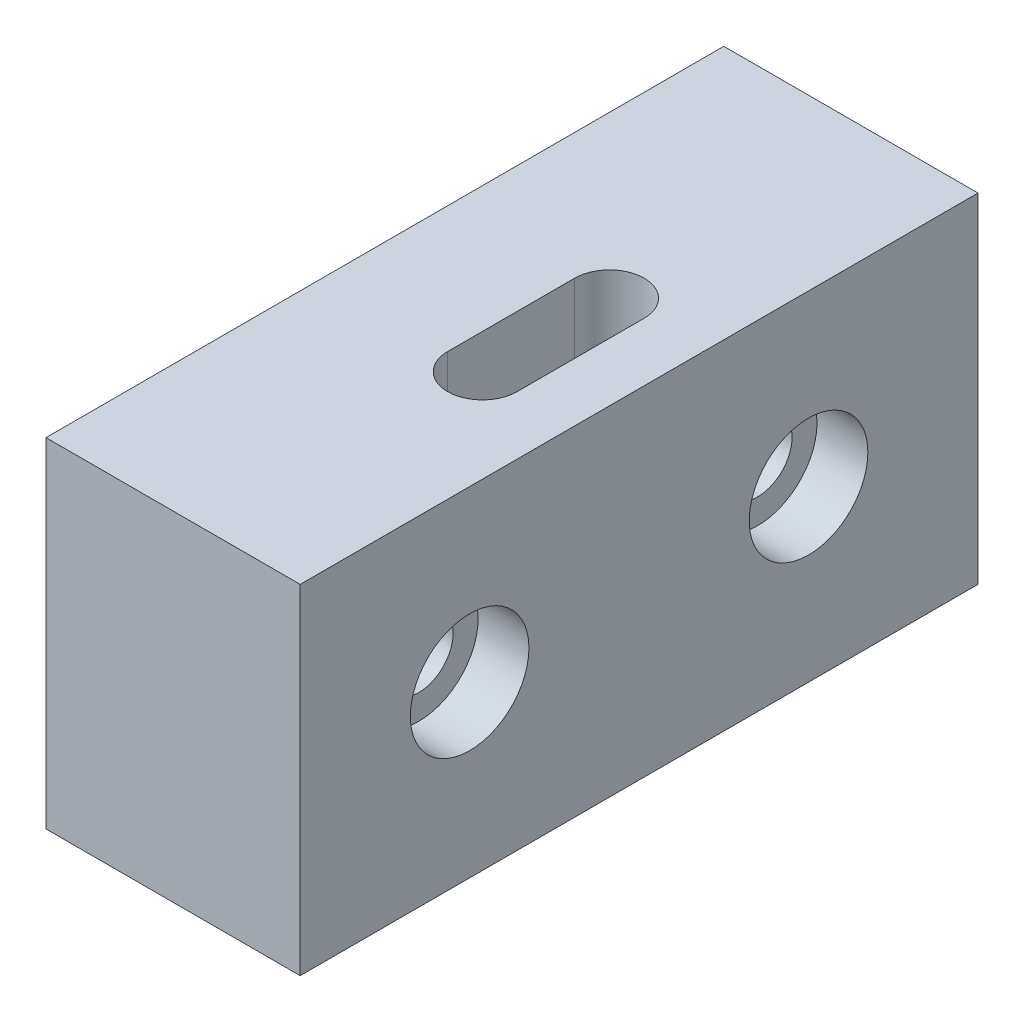
ISO-10303-21;
HEADER;
FILE_DESCRIPTION(('STEP AP214'),'2;1');
FILE_NAME('part.step','',(''),(''),'','','');
FILE_SCHEMA(('AUTOMOTIVE_DESIGN { 1 0 10303 214 1 1 1 1 }'));
ENDSEC;
DATA;
#1=APPLICATION_CONTEXT('core data for automotive mechanical design processes');
#2=APPLICATION_PROTOCOL_DEFINITION('international standard','automotive_design',2000,#1);
#3=PRODUCT_CONTEXT('',#1,'mechanical');
#4=PRODUCT('Part','Part','',(#3));
#5=PRODUCT_RELATED_PRODUCT_CATEGORY('part','',(#4));
#6=PRODUCT_DEFINITION_FORMATION('','',#4);
#7=PRODUCT_DEFINITION_CONTEXT('part definition',#1,'design');
#8=PRODUCT_DEFINITION('design','',#6,#7);
#9=PRODUCT_DEFINITION_SHAPE('','',#8);
#10=(LENGTH_UNIT() NAMED_UNIT(*) SI_UNIT(.MILLI.,.METRE.));
#11=(NAMED_UNIT(*) PLANE_ANGLE_UNIT() SI_UNIT($,.RADIAN.));
#12=(NAMED_UNIT(*) SI_UNIT($,.STERADIAN.) SOLID_ANGLE_UNIT());
#13=UNCERTAINTY_MEASURE_WITH_UNIT(LENGTH_MEASURE(1.E-05),#10,'distance_accuracy_value','');
#14=(GEOMETRIC_REPRESENTATION_CONTEXT(3) GLOBAL_UNCERTAINTY_ASSIGNED_CONTEXT((#13)) GLOBAL_UNIT_ASSIGNED_CONTEXT((#10,
#11,#12)) REPRESENTATION_CONTEXT('',''));
#15=CARTESIAN_POINT('',(0.,0.,0.));
#16=DIRECTION('',(0.,0.,1.));
#17=DIRECTION('',(1.,0.,0.));
#18=AXIS2_PLACEMENT_3D('',#15,#16,#17);
#19=CARTESIAN_POINT('',(0.,-20.,-40.));
#20=DIRECTION('',(0.,-1.,0.));
#21=DIRECTION('',(0.,0.,-1.));
#22=AXIS2_PLACEMENT_3D('',#19,#20,#21);
#23=PLANE('',#22);
#24=DIRECTION('',(0.,0.,1.));
#25=VECTOR('',#24,1.);
#26=CARTESIAN_POINT('',(15.,-20.,-40.));
#27=LINE('',#26,#25);
#28=CARTESIAN_POINT('',(15.,-20.,-40.));
#29=VERTEX_POINT('',#28);
#30=CARTESIAN_POINT('',(15.,-20.,40.));
#31=VERTEX_POINT('',#30);
#32=EDGE_CURVE('E162',#29,#31,#27,.T.);
#33=ORIENTED_EDGE('',*,*,#32,.T.);
#34=DIRECTION('',(1.,0.,0.));
#35=VECTOR('',#34,1.);
#36=CARTESIAN_POINT('',(0.,-20.,40.));
#37=LINE('',#36,#35);
#38=CARTESIAN_POINT('',(-15.,-20.,40.));
#39=VERTEX_POINT('',#38);
#40=EDGE_CURVE('E140',#39,#31,#37,.T.);
#41=ORIENTED_EDGE('',*,*,#40,.F.);
#42=DIRECTION('',(0.,0.,1.));
#43=VECTOR('',#42,1.);
#44=CARTESIAN_POINT('',(-15.,-20.,-40.));
#45=LINE('',#44,#43);
#46=CARTESIAN_POINT('',(-15.,-20.,-40.));
#47=VERTEX_POINT('',#46);
#48=EDGE_CURVE('E163',#47,#39,#45,.T.);
#49=ORIENTED_EDGE('',*,*,#48,.F.);
#50=DIRECTION('',(1.,0.,0.));
#51=VECTOR('',#50,1.);
#52=CARTESIAN_POINT('',(0.,-20.,-40.));
#53=LINE('',#52,#51);
#54=EDGE_CURVE('E152',#47,#29,#53,.T.);
#55=ORIENTED_EDGE('',*,*,#54,.T.);
#56=EDGE_LOOP('',(#33,#41,#49,#55));
#57=FACE_BOUND('',#56,.T.);
#58=DIRECTION('',(0.,0.,1.));
#59=VECTOR('',#58,1.);
#60=CARTESIAN_POINT('',(-0.100000000000008,-20.,-40.));
#61=LINE('',#60,#59);
#62=CARTESIAN_POINT('',(-0.100000000000002,-20.,-7.5));
#63=VERTEX_POINT('',#62);
#64=CARTESIAN_POINT('',(-0.0999999999999994,-20.,7.5));
#65=VERTEX_POINT('',#64);
#66=EDGE_CURVE('E95',#63,#65,#61,.T.);
#67=ORIENTED_EDGE('',*,*,#66,.T.);
#68=CARTESIAN_POINT('',(4.,-20.,7.5));
#69=DIRECTION('',(0.,-1.,0.));
#70=DIRECTION('',(0.,0.,-1.));
#71=AXIS2_PLACEMENT_3D('',#68,#69,#70);
#72=CIRCLE('',#71,4.1);
#73=CARTESIAN_POINT('',(8.1,-20.,7.5));
#74=VERTEX_POINT('',#73);
#75=EDGE_CURVE('E115',#65,#74,#72,.F.);
#76=ORIENTED_EDGE('',*,*,#75,.T.);
#77=DIRECTION('',(0.,0.,-1.));
#78=VECTOR('',#77,1.);
#79=CARTESIAN_POINT('',(8.09999999999999,-20.,-40.));
#80=LINE('',#79,#78);
#81=CARTESIAN_POINT('',(8.1,-20.,-7.5));
#82=VERTEX_POINT('',#81);
#83=EDGE_CURVE('E113',#74,#82,#80,.T.);
#84=ORIENTED_EDGE('',*,*,#83,.T.);
#85=CARTESIAN_POINT('',(4.,-20.,-7.5));
#86=DIRECTION('',(0.,-1.,0.));
#87=DIRECTION('',(0.,0.,-1.));
#88=AXIS2_PLACEMENT_3D('',#85,#86,#87);
#89=CIRCLE('',#88,4.1);
#90=EDGE_CURVE('E100',#82,#63,#89,.F.);
#91=ORIENTED_EDGE('',*,*,#90,.T.);
#92=EDGE_LOOP('',(#67,#76,#84,#91));
#93=FACE_BOUND('',#92,.T.);
#94=ADVANCED_FACE('F35',(#57,#93),#23,.T.);
#95=CARTESIAN_POINT('',(0.,20.,-40.));
#96=DIRECTION('',(0.,-1.,0.));
#97=DIRECTION('',(0.,0.,-1.));
#98=AXIS2_PLACEMENT_3D('',#95,#96,#97);
#99=PLANE('',#98);
#100=DIRECTION('',(0.,0.,1.));
#101=VECTOR('',#100,1.);
#102=CARTESIAN_POINT('',(-15.,20.,-40.));
#103=LINE('',#102,#101);
#104=CARTESIAN_POINT('',(-15.,20.,-40.));
#105=VERTEX_POINT('',#104);
#106=CARTESIAN_POINT('',(-15.,20.,40.));
#107=VERTEX_POINT('',#106);
#108=EDGE_CURVE('E166',#105,#107,#103,.T.);
#109=ORIENTED_EDGE('',*,*,#108,.T.);
#110=DIRECTION('',(1.,0.,0.));
#111=VECTOR('',#110,1.);
#112=CARTESIAN_POINT('',(0.,20.,40.));
#113=LINE('',#112,#111);
#114=CARTESIAN_POINT('',(15.,20.,40.));
#115=VERTEX_POINT('',#114);
#116=EDGE_CURVE('E146',#107,#115,#113,.T.);
#117=ORIENTED_EDGE('',*,*,#116,.T.);
#118=DIRECTION('',(0.,0.,1.));
#119=VECTOR('',#118,1.);
#120=CARTESIAN_POINT('',(15.,20.,-40.));
#121=LINE('',#120,#119);
#122=CARTESIAN_POINT('',(15.,20.,-40.));
#123=VERTEX_POINT('',#122);
#124=EDGE_CURVE('E168',#123,#115,#121,.T.);
#125=ORIENTED_EDGE('',*,*,#124,.F.);
#126=DIRECTION('',(1.,0.,0.));
#127=VECTOR('',#126,1.);
#128=CARTESIAN_POINT('',(0.,20.,-40.));
#129=LINE('',#128,#127);
#130=EDGE_CURVE('E158',#105,#123,#129,.T.);
#131=ORIENTED_EDGE('',*,*,#130,.F.);
#132=EDGE_LOOP('',(#109,#117,#125,#131));
#133=FACE_BOUND('',#132,.T.);
#134=CARTESIAN_POINT('',(4.,20.,7.5));
#135=DIRECTION('',(0.,-1.,0.));
#136=DIRECTION('',(0.,0.,-1.));
#137=AXIS2_PLACEMENT_3D('',#134,#135,#136);
#138=CIRCLE('',#137,4.1);
#139=CARTESIAN_POINT('',(-0.0999999999999994,20.,7.5));
#140=VERTEX_POINT('',#139);
#141=CARTESIAN_POINT('',(8.1,20.,7.5));
#142=VERTEX_POINT('',#141);
#143=EDGE_CURVE('E11',#140,#142,#138,.F.);
#144=ORIENTED_EDGE('',*,*,#143,.F.);
#145=DIRECTION('',(0.,0.,1.));
#146=VECTOR('',#145,1.);
#147=CARTESIAN_POINT('',(-0.100000000000008,20.,-40.));
#148=LINE('',#147,#146);
#149=CARTESIAN_POINT('',(-0.100000000000002,20.,-7.5));
#150=VERTEX_POINT('',#149);
#151=EDGE_CURVE('E165',#150,#140,#148,.T.);
#152=ORIENTED_EDGE('',*,*,#151,.F.);
#153=CARTESIAN_POINT('',(4.,20.,-7.5));
#154=DIRECTION('',(0.,-1.,0.));
#155=DIRECTION('',(0.,0.,-1.));
#156=AXIS2_PLACEMENT_3D('',#153,#154,#155);
#157=CIRCLE('',#156,4.1);
#158=CARTESIAN_POINT('',(8.1,20.,-7.5));
#159=VERTEX_POINT('',#158);
#160=EDGE_CURVE('E108',#159,#150,#157,.F.);
#161=ORIENTED_EDGE('',*,*,#160,.F.);
#162=DIRECTION('',(0.,0.,-1.));
#163=VECTOR('',#162,1.);
#164=CARTESIAN_POINT('',(8.09999999999999,20.,-40.));
#165=LINE('',#164,#163);
#166=EDGE_CURVE('E42',#142,#159,#165,.T.);
#167=ORIENTED_EDGE('',*,*,#166,.F.);
#168=EDGE_LOOP('',(#144,#152,#161,#167));
#169=FACE_BOUND('',#168,.T.);
#170=ADVANCED_FACE('F184',(#133,#169),#99,.F.);
#171=CARTESIAN_POINT('',(80.,0.,-20.));
#172=DIRECTION('',(-1.,0.,0.));
#173=DIRECTION('',(0.,0.,1.));
#174=AXIS2_PLACEMENT_3D('',#171,#172,#173);
#175=CYLINDRICAL_SURFACE('',#174,4.05);
#176=CARTESIAN_POINT('',(-15.,0.,-20.));
#177=DIRECTION('',(1.,0.,0.));
#178=DIRECTION('',(0.,0.,-1.));
#179=AXIS2_PLACEMENT_3D('',#176,#177,#178);
#180=CIRCLE('',#179,4.05);
#181=CARTESIAN_POINT('',(-15.,0.,-24.05));
#182=VERTEX_POINT('',#181);
#183=EDGE_CURVE('E133',#182,#182,#180,.F.);
#184=ORIENTED_EDGE('',*,*,#183,.T.);
#185=EDGE_LOOP('',(#184));
#186=FACE_BOUND('',#185,.T.);
#187=CARTESIAN_POINT('',(8.99999999999999,0.,-20.));
#188=DIRECTION('',(1.,0.,0.));
#189=DIRECTION('',(0.,0.,-1.));
#190=AXIS2_PLACEMENT_3D('',#187,#188,#189);
#191=CIRCLE('',#190,4.05);
#192=CARTESIAN_POINT('',(8.99999999999999,0.,-24.05));
#193=VERTEX_POINT('',#192);
#194=EDGE_CURVE('E137',#193,#193,#191,.T.);
#195=ORIENTED_EDGE('',*,*,#194,.T.);
#196=EDGE_LOOP('',(#195));
#197=FACE_BOUND('',#196,.T.);
#198=ADVANCED_FACE('F205',(#186,#197),#175,.F.);
#199=CARTESIAN_POINT('',(80.,0.,20.));
#200=DIRECTION('',(-1.,0.,0.));
#201=DIRECTION('',(0.,0.,1.));
#202=AXIS2_PLACEMENT_3D('',#199,#200,#201);
#203=CYLINDRICAL_SURFACE('',#202,4.05);
#204=CARTESIAN_POINT('',(-15.,0.,20.));
#205=DIRECTION('',(1.,0.,0.));
#206=DIRECTION('',(0.,0.,-1.));
#207=AXIS2_PLACEMENT_3D('',#204,#205,#206);
#208=CIRCLE('',#207,4.05);
#209=CARTESIAN_POINT('',(-15.,0.,15.95));
#210=VERTEX_POINT('',#209);
#211=EDGE_CURVE('E136',#210,#210,#208,.F.);
#212=ORIENTED_EDGE('',*,*,#211,.T.);
#213=EDGE_LOOP('',(#212));
#214=FACE_BOUND('',#213,.T.);
#215=CARTESIAN_POINT('',(8.99999999999999,0.,20.));
#216=DIRECTION('',(1.,0.,0.));
#217=DIRECTION('',(0.,0.,-1.));
#218=AXIS2_PLACEMENT_3D('',#215,#216,#217);
#219=CIRCLE('',#218,4.05);
#220=CARTESIAN_POINT('',(8.99999999999999,0.,15.95));
#221=VERTEX_POINT('',#220);
#222=EDGE_CURVE('E124',#221,#221,#219,.T.);
#223=ORIENTED_EDGE('',*,*,#222,.T.);
#224=EDGE_LOOP('',(#223));
#225=FACE_BOUND('',#224,.T.);
#226=ADVANCED_FACE('F238',(#214,#225),#203,.F.);
#227=CARTESIAN_POINT('',(-15.,0.,-40.));
#228=DIRECTION('',(1.,0.,0.));
#229=DIRECTION('',(0.,0.,-1.));
#230=AXIS2_PLACEMENT_3D('',#227,#228,#229);
#231=PLANE('',#230);
#232=ORIENTED_EDGE('',*,*,#211,.F.);
#233=EDGE_LOOP('',(#232));
#234=FACE_BOUND('',#233,.T.);
#235=ORIENTED_EDGE('',*,*,#183,.F.);
#236=EDGE_LOOP('',(#235));
#237=FACE_BOUND('',#236,.T.);
#238=ORIENTED_EDGE('',*,*,#48,.T.);
#239=DIRECTION('',(0.,1.,0.));
#240=VECTOR('',#239,1.);
#241=CARTESIAN_POINT('',(-15.,0.,40.));
#242=LINE('',#241,#240);
#243=EDGE_CURVE('E149',#39,#107,#242,.T.);
#244=ORIENTED_EDGE('',*,*,#243,.T.);
#245=ORIENTED_EDGE('',*,*,#108,.F.);
#246=DIRECTION('',(0.,1.,0.));
#247=VECTOR('',#246,1.);
#248=CARTESIAN_POINT('',(-15.,0.,-40.));
#249=LINE('',#248,#247);
#250=EDGE_CURVE('E160',#47,#105,#249,.T.);
#251=ORIENTED_EDGE('',*,*,#250,.F.);
#252=EDGE_LOOP('',(#238,#244,#245,#251));
#253=FACE_BOUND('',#252,.T.);
#254=ADVANCED_FACE('F221',(#234,#237,#253),#231,.F.);
#255=CARTESIAN_POINT('',(15.,0.,-40.));
#256=DIRECTION('',(1.,0.,0.));
#257=DIRECTION('',(0.,0.,-1.));
#258=AXIS2_PLACEMENT_3D('',#255,#256,#257);
#259=PLANE('',#258);
#260=CARTESIAN_POINT('',(15.,0.,20.));
#261=DIRECTION('',(1.,0.,0.));
#262=DIRECTION('',(0.,0.,-1.));
#263=AXIS2_PLACEMENT_3D('',#260,#261,#262);
#264=CIRCLE('',#263,7.);
#265=CARTESIAN_POINT('',(15.,0.,13.));
#266=VERTEX_POINT('',#265);
#267=EDGE_CURVE('E125',#266,#266,#264,.T.);
#268=ORIENTED_EDGE('',*,*,#267,.F.);
#269=EDGE_LOOP('',(#268));
#270=FACE_BOUND('',#269,.T.);
#271=CARTESIAN_POINT('',(15.,0.,-20.));
#272=DIRECTION('',(1.,0.,0.));
#273=DIRECTION('',(0.,0.,-1.));
#274=AXIS2_PLACEMENT_3D('',#271,#272,#273);
#275=CIRCLE('',#274,7.);
#276=CARTESIAN_POINT('',(15.,0.,-27.));
#277=VERTEX_POINT('',#276);
#278=EDGE_CURVE('E120',#277,#277,#275,.T.);
#279=ORIENTED_EDGE('',*,*,#278,.F.);
#280=EDGE_LOOP('',(#279));
#281=FACE_BOUND('',#280,.T.);
#282=ORIENTED_EDGE('',*,*,#124,.T.);
#283=DIRECTION('',(0.,1.,0.));
#284=VECTOR('',#283,1.);
#285=CARTESIAN_POINT('',(15.,0.,40.));
#286=LINE('',#285,#284);
#287=EDGE_CURVE('E143',#31,#115,#286,.T.);
#288=ORIENTED_EDGE('',*,*,#287,.F.);
#289=ORIENTED_EDGE('',*,*,#32,.F.);
#290=DIRECTION('',(0.,1.,0.));
#291=VECTOR('',#290,1.);
#292=CARTESIAN_POINT('',(15.,0.,-40.));
#293=LINE('',#292,#291);
#294=EDGE_CURVE('E155',#29,#123,#293,.T.);
#295=ORIENTED_EDGE('',*,*,#294,.T.);
#296=EDGE_LOOP('',(#282,#288,#289,#295));
#297=FACE_BOUND('',#296,.T.);
#298=ADVANCED_FACE('F214',(#270,#281,#297),#259,.T.);
#299=CARTESIAN_POINT('',(0.,0.,-40.));
#300=DIRECTION('',(0.,0.,1.));
#301=DIRECTION('',(1.,0.,0.));
#302=AXIS2_PLACEMENT_3D('',#299,#300,#301);
#303=PLANE('',#302);
#304=ORIENTED_EDGE('',*,*,#54,.F.);
#305=ORIENTED_EDGE('',*,*,#250,.T.);
#306=ORIENTED_EDGE('',*,*,#130,.T.);
#307=ORIENTED_EDGE('',*,*,#294,.F.);
#308=EDGE_LOOP('',(#304,#305,#306,#307));
#309=FACE_BOUND('',#308,.T.);
#310=ADVANCED_FACE('F225',(#309),#303,.F.);
#311=CARTESIAN_POINT('',(0.,0.,40.));
#312=DIRECTION('',(0.,0.,1.));
#313=DIRECTION('',(1.,0.,0.));
#314=AXIS2_PLACEMENT_3D('',#311,#312,#313);
#315=PLANE('',#314);
#316=ORIENTED_EDGE('',*,*,#40,.T.);
#317=ORIENTED_EDGE('',*,*,#287,.T.);
#318=ORIENTED_EDGE('',*,*,#116,.F.);
#319=ORIENTED_EDGE('',*,*,#243,.F.);
#320=EDGE_LOOP('',(#316,#317,#318,#319));
#321=FACE_BOUND('',#320,.T.);
#322=ADVANCED_FACE('F218',(#321),#315,.T.);
#323=CARTESIAN_POINT('',(9.,0.,20.));
#324=DIRECTION('',(1.,0.,0.));
#325=DIRECTION('',(0.,0.,-1.));
#326=AXIS2_PLACEMENT_3D('',#323,#324,#325);
#327=CYLINDRICAL_SURFACE('',#326,7.);
#328=CARTESIAN_POINT('',(9.,0.,20.));
#329=DIRECTION('',(1.,0.,0.));
#330=DIRECTION('',(0.,0.,-1.));
#331=AXIS2_PLACEMENT_3D('',#328,#329,#330);
#332=CIRCLE('',#331,7.);
#333=CARTESIAN_POINT('',(9.,0.,13.));
#334=VERTEX_POINT('',#333);
#335=EDGE_CURVE('E121',#334,#334,#332,.T.);
#336=ORIENTED_EDGE('',*,*,#335,.F.);
#337=EDGE_LOOP('',(#336));
#338=FACE_BOUND('',#337,.T.);
#339=ORIENTED_EDGE('',*,*,#267,.T.);
#340=EDGE_LOOP('',(#339));
#341=FACE_BOUND('',#340,.T.);
#342=ADVANCED_FACE('F232',(#338,#341),#327,.F.);
#343=CARTESIAN_POINT('',(9.,0.,20.));
#344=DIRECTION('',(1.,0.,0.));
#345=DIRECTION('',(0.,0.,-1.));
#346=AXIS2_PLACEMENT_3D('',#343,#344,#345);
#347=PLANE('',#346);
#348=ORIENTED_EDGE('',*,*,#222,.F.);
#349=EDGE_LOOP('',(#348));
#350=FACE_BOUND('',#349,.T.);
#351=ORIENTED_EDGE('',*,*,#335,.T.);
#352=EDGE_LOOP('',(#351));
#353=FACE_BOUND('',#352,.T.);
#354=ADVANCED_FACE('F257',(#350,#353),#347,.T.);
#355=CARTESIAN_POINT('',(9.,0.,-20.));
#356=DIRECTION('',(1.,0.,0.));
#357=DIRECTION('',(0.,0.,-1.));
#358=AXIS2_PLACEMENT_3D('',#355,#356,#357);
#359=CYLINDRICAL_SURFACE('',#358,7.);
#360=CARTESIAN_POINT('',(9.,0.,-20.));
#361=DIRECTION('',(1.,0.,0.));
#362=DIRECTION('',(0.,0.,-1.));
#363=AXIS2_PLACEMENT_3D('',#360,#361,#362);
#364=CIRCLE('',#363,7.);
#365=CARTESIAN_POINT('',(9.,0.,-27.));
#366=VERTEX_POINT('',#365);
#367=EDGE_CURVE('E128',#366,#366,#364,.T.);
#368=ORIENTED_EDGE('',*,*,#367,.F.);
#369=EDGE_LOOP('',(#368));
#370=FACE_BOUND('',#369,.T.);
#371=ORIENTED_EDGE('',*,*,#278,.T.);
#372=EDGE_LOOP('',(#371));
#373=FACE_BOUND('',#372,.T.);
#374=ADVANCED_FACE('F196',(#370,#373),#359,.F.);
#375=CARTESIAN_POINT('',(9.,0.,-20.));
#376=DIRECTION('',(1.,0.,0.));
#377=DIRECTION('',(0.,0.,-1.));
#378=AXIS2_PLACEMENT_3D('',#375,#376,#377);
#379=PLANE('',#378);
#380=ORIENTED_EDGE('',*,*,#194,.F.);
#381=EDGE_LOOP('',(#380));
#382=FACE_BOUND('',#381,.T.);
#383=ORIENTED_EDGE('',*,*,#367,.T.);
#384=EDGE_LOOP('',(#383));
#385=FACE_BOUND('',#384,.T.);
#386=ADVANCED_FACE('F189',(#382,#385),#379,.T.);
#387=CARTESIAN_POINT('',(4.,36.,7.5));
#388=DIRECTION('',(0.,-1.,0.));
#389=DIRECTION('',(0.,0.,-1.));
#390=AXIS2_PLACEMENT_3D('',#387,#388,#389);
#391=CYLINDRICAL_SURFACE('',#390,4.1);
#392=DIRECTION('',(0.,-1.,0.));
#393=VECTOR('',#392,1.);
#394=CARTESIAN_POINT('',(-0.0999999999999994,36.,7.5));
#395=LINE('',#394,#393);
#396=EDGE_CURVE('E49',#140,#65,#395,.T.);
#397=ORIENTED_EDGE('',*,*,#396,.F.);
#398=ORIENTED_EDGE('',*,*,#143,.T.);
#399=DIRECTION('',(0.,-1.,0.));
#400=VECTOR('',#399,1.);
#401=CARTESIAN_POINT('',(8.1,36.,7.5));
#402=LINE('',#401,#400);
#403=EDGE_CURVE('E101',#142,#74,#402,.T.);
#404=ORIENTED_EDGE('',*,*,#403,.T.);
#405=ORIENTED_EDGE('',*,*,#75,.F.);
#406=EDGE_LOOP('',(#397,#398,#404,#405));
#407=FACE_BOUND('',#406,.T.);
#408=ADVANCED_FACE('F186',(#407),#391,.F.);
#409=CARTESIAN_POINT('',(8.1,36.,7.5));
#410=DIRECTION('',(-1.,0.,0.));
#411=DIRECTION('',(0.,0.,1.));
#412=AXIS2_PLACEMENT_3D('',#409,#410,#411);
#413=PLANE('',#412);
#414=ORIENTED_EDGE('',*,*,#403,.F.);
#415=ORIENTED_EDGE('',*,*,#166,.T.);
#416=DIRECTION('',(0.,-1.,0.));
#417=VECTOR('',#416,1.);
#418=CARTESIAN_POINT('',(8.1,36.,-7.5));
#419=LINE('',#418,#417);
#420=EDGE_CURVE('E110',#159,#82,#419,.T.);
#421=ORIENTED_EDGE('',*,*,#420,.T.);
#422=ORIENTED_EDGE('',*,*,#83,.F.);
#423=EDGE_LOOP('',(#414,#415,#421,#422));
#424=FACE_BOUND('',#423,.T.);
#425=ADVANCED_FACE('F179',(#424),#413,.T.);
#426=CARTESIAN_POINT('',(4.,36.,-7.5));
#427=DIRECTION('',(0.,-1.,0.));
#428=DIRECTION('',(0.,0.,-1.));
#429=AXIS2_PLACEMENT_3D('',#426,#427,#428);
#430=CYLINDRICAL_SURFACE('',#429,4.1);
#431=ORIENTED_EDGE('',*,*,#420,.F.);
#432=ORIENTED_EDGE('',*,*,#160,.T.);
#433=DIRECTION('',(0.,-1.,0.));
#434=VECTOR('',#433,1.);
#435=CARTESIAN_POINT('',(-0.100000000000002,36.,-7.5));
#436=LINE('',#435,#434);
#437=EDGE_CURVE('E54',#150,#63,#436,.T.);
#438=ORIENTED_EDGE('',*,*,#437,.T.);
#439=ORIENTED_EDGE('',*,*,#90,.F.);
#440=EDGE_LOOP('',(#431,#432,#438,#439));
#441=FACE_BOUND('',#440,.T.);
#442=ADVANCED_FACE('F105',(#441),#430,.F.);
#443=CARTESIAN_POINT('',(-0.0999999999999994,36.,7.5));
#444=DIRECTION('',(1.,0.,0.));
#445=DIRECTION('',(0.,0.,-1.));
#446=AXIS2_PLACEMENT_3D('',#443,#444,#445);
#447=PLANE('',#446);
#448=ORIENTED_EDGE('',*,*,#437,.F.);
#449=ORIENTED_EDGE('',*,*,#151,.T.);
#450=ORIENTED_EDGE('',*,*,#396,.T.);
#451=ORIENTED_EDGE('',*,*,#66,.F.);
#452=EDGE_LOOP('',(#448,#449,#450,#451));
#453=FACE_BOUND('',#452,.T.);
#454=ADVANCED_FACE('F96',(#453),#447,.T.);
#455=CLOSED_SHELL('',(#94,#170,#198,#226,#254,#298,#310,#322,#342,#354,#374,#386,#408,#425,#442,#454));
#456=MANIFOLD_SOLID_BREP('B2',#455);
#457=ADVANCED_BREP_SHAPE_REPRESENTATION('',(#18,#456),#14);
#458=SHAPE_DEFINITION_REPRESENTATION(#9,#457);
ENDSEC;
END-ISO-10303-21;
